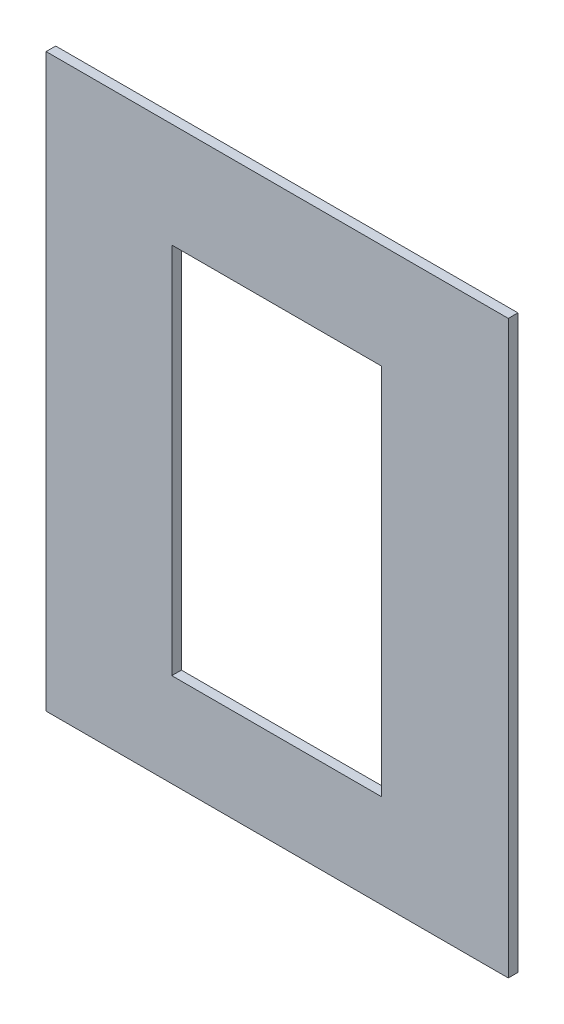
ISO-10303-21;
HEADER;
FILE_DESCRIPTION(('STEP AP214'),'2;1');
FILE_NAME('part.step','',(''),(''),'','','');
FILE_SCHEMA(('AUTOMOTIVE_DESIGN { 1 0 10303 214 1 1 1 1 }'));
ENDSEC;
DATA;
#1=APPLICATION_CONTEXT('core data for automotive mechanical design processes');
#2=APPLICATION_PROTOCOL_DEFINITION('international standard','automotive_design',2000,#1);
#3=PRODUCT_CONTEXT('',#1,'mechanical');
#4=PRODUCT('Part','Part','',(#3));
#5=PRODUCT_RELATED_PRODUCT_CATEGORY('part','',(#4));
#6=PRODUCT_DEFINITION_FORMATION('','',#4);
#7=PRODUCT_DEFINITION_CONTEXT('part definition',#1,'design');
#8=PRODUCT_DEFINITION('design','',#6,#7);
#9=PRODUCT_DEFINITION_SHAPE('','',#8);
#10=(LENGTH_UNIT() NAMED_UNIT(*) SI_UNIT(.MILLI.,.METRE.));
#11=(NAMED_UNIT(*) PLANE_ANGLE_UNIT() SI_UNIT($,.RADIAN.));
#12=(NAMED_UNIT(*) SI_UNIT($,.STERADIAN.) SOLID_ANGLE_UNIT());
#13=UNCERTAINTY_MEASURE_WITH_UNIT(LENGTH_MEASURE(1.E-05),#10,'distance_accuracy_value','');
#14=(GEOMETRIC_REPRESENTATION_CONTEXT(3) GLOBAL_UNCERTAINTY_ASSIGNED_CONTEXT((#13)) GLOBAL_UNIT_ASSIGNED_CONTEXT((#10,
#11,#12)) REPRESENTATION_CONTEXT('',''));
#15=CARTESIAN_POINT('',(0.,0.,0.));
#16=DIRECTION('',(0.,0.,1.));
#17=DIRECTION('',(1.,0.,0.));
#18=AXIS2_PLACEMENT_3D('',#15,#16,#17);
#19=CARTESIAN_POINT('',(438.94375,542.528125,18.25625));
#20=DIRECTION('',(-1.,0.,0.));
#21=DIRECTION('',(0.,-1.,0.));
#22=AXIS2_PLACEMENT_3D('',#19,#20,#21);
#23=PLANE('',#22);
#24=DIRECTION('',(0.,1.,0.));
#25=VECTOR('',#24,1.);
#26=CARTESIAN_POINT('',(438.94375,542.528125,0.));
#27=LINE('',#26,#25);
#28=CARTESIAN_POINT('',(438.94375,-542.528125,0.));
#29=VERTEX_POINT('',#28);
#30=CARTESIAN_POINT('',(438.94375,542.528125,0.));
#31=VERTEX_POINT('',#30);
#32=EDGE_CURVE('E124',#29,#31,#27,.T.);
#33=ORIENTED_EDGE('',*,*,#32,.T.);
#34=DIRECTION('',(0.,0.,-1.));
#35=VECTOR('',#34,1.);
#36=CARTESIAN_POINT('',(438.94375,542.528125,18.25625));
#37=LINE('',#36,#35);
#38=CARTESIAN_POINT('',(438.94375,542.528125,18.25625));
#39=VERTEX_POINT('',#38);
#40=EDGE_CURVE('E153',#39,#31,#37,.T.);
#41=ORIENTED_EDGE('',*,*,#40,.F.);
#42=DIRECTION('',(0.,1.,0.));
#43=VECTOR('',#42,1.);
#44=CARTESIAN_POINT('',(438.94375,542.528125,18.25625));
#45=LINE('',#44,#43);
#46=CARTESIAN_POINT('',(438.94375,-542.528125,18.25625));
#47=VERTEX_POINT('',#46);
#48=EDGE_CURVE('E127',#47,#39,#45,.T.);
#49=ORIENTED_EDGE('',*,*,#48,.F.);
#50=DIRECTION('',(0.,0.,-1.));
#51=VECTOR('',#50,1.);
#52=CARTESIAN_POINT('',(438.94375,-542.528125,18.25625));
#53=LINE('',#52,#51);
#54=EDGE_CURVE('E137',#47,#29,#53,.T.);
#55=ORIENTED_EDGE('',*,*,#54,.T.);
#56=EDGE_LOOP('',(#33,#41,#49,#55));
#57=FACE_BOUND('',#56,.T.);
#58=ADVANCED_FACE('F34',(#57),#23,.F.);
#59=CARTESIAN_POINT('',(-438.94375,542.528125,18.25625));
#60=DIRECTION('',(0.,-1.,0.));
#61=DIRECTION('',(0.,0.,-1.));
#62=AXIS2_PLACEMENT_3D('',#59,#60,#61);
#63=PLANE('',#62);
#64=DIRECTION('',(-1.,0.,0.));
#65=VECTOR('',#64,1.);
#66=CARTESIAN_POINT('',(-438.94375,542.528125,0.));
#67=LINE('',#66,#65);
#68=CARTESIAN_POINT('',(-438.94375,542.528125,0.));
#69=VERTEX_POINT('',#68);
#70=EDGE_CURVE('E140',#31,#69,#67,.T.);
#71=ORIENTED_EDGE('',*,*,#70,.T.);
#72=DIRECTION('',(0.,0.,-1.));
#73=VECTOR('',#72,1.);
#74=CARTESIAN_POINT('',(-438.94375,542.528125,18.25625));
#75=LINE('',#74,#73);
#76=CARTESIAN_POINT('',(-438.94375,542.528125,18.25625));
#77=VERTEX_POINT('',#76);
#78=EDGE_CURVE('E150',#77,#69,#75,.T.);
#79=ORIENTED_EDGE('',*,*,#78,.F.);
#80=DIRECTION('',(-1.,0.,0.));
#81=VECTOR('',#80,1.);
#82=CARTESIAN_POINT('',(-438.94375,542.528125,18.25625));
#83=LINE('',#82,#81);
#84=EDGE_CURVE('E130',#39,#77,#83,.T.);
#85=ORIENTED_EDGE('',*,*,#84,.F.);
#86=ORIENTED_EDGE('',*,*,#40,.T.);
#87=EDGE_LOOP('',(#71,#79,#85,#86));
#88=FACE_BOUND('',#87,.T.);
#89=ADVANCED_FACE('F177',(#88),#63,.F.);
#90=CARTESIAN_POINT('',(-438.94375,542.528125,18.25625));
#91=DIRECTION('',(1.,0.,0.));
#92=DIRECTION('',(0.,1.,0.));
#93=AXIS2_PLACEMENT_3D('',#90,#91,#92);
#94=PLANE('',#93);
#95=DIRECTION('',(0.,-1.,0.));
#96=VECTOR('',#95,1.);
#97=CARTESIAN_POINT('',(-438.94375,542.528125,0.));
#98=LINE('',#97,#96);
#99=CARTESIAN_POINT('',(-438.94375,-542.528125,0.));
#100=VERTEX_POINT('',#99);
#101=EDGE_CURVE('E142',#69,#100,#98,.T.);
#102=ORIENTED_EDGE('',*,*,#101,.T.);
#103=DIRECTION('',(0.,0.,-1.));
#104=VECTOR('',#103,1.);
#105=CARTESIAN_POINT('',(-438.94375,-542.528125,18.25625));
#106=LINE('',#105,#104);
#107=CARTESIAN_POINT('',(-438.94375,-542.528125,18.25625));
#108=VERTEX_POINT('',#107);
#109=EDGE_CURVE('E147',#108,#100,#106,.T.);
#110=ORIENTED_EDGE('',*,*,#109,.F.);
#111=DIRECTION('',(0.,-1.,0.));
#112=VECTOR('',#111,1.);
#113=CARTESIAN_POINT('',(-438.94375,542.528125,18.25625));
#114=LINE('',#113,#112);
#115=EDGE_CURVE('E133',#77,#108,#114,.T.);
#116=ORIENTED_EDGE('',*,*,#115,.F.);
#117=ORIENTED_EDGE('',*,*,#78,.T.);
#118=EDGE_LOOP('',(#102,#110,#116,#117));
#119=FACE_BOUND('',#118,.T.);
#120=ADVANCED_FACE('F182',(#119),#94,.F.);
#121=CARTESIAN_POINT('',(-438.94375,-542.528125,18.25625));
#122=DIRECTION('',(0.,1.,0.));
#123=DIRECTION('',(0.,0.,1.));
#124=AXIS2_PLACEMENT_3D('',#121,#122,#123);
#125=PLANE('',#124);
#126=DIRECTION('',(1.,0.,0.));
#127=VECTOR('',#126,1.);
#128=CARTESIAN_POINT('',(-438.94375,-542.528125,0.));
#129=LINE('',#128,#127);
#130=EDGE_CURVE('E131',#100,#29,#129,.T.);
#131=ORIENTED_EDGE('',*,*,#130,.T.);
#132=ORIENTED_EDGE('',*,*,#54,.F.);
#133=DIRECTION('',(1.,0.,0.));
#134=VECTOR('',#133,1.);
#135=CARTESIAN_POINT('',(-438.94375,-542.528125,18.25625));
#136=LINE('',#135,#134);
#137=EDGE_CURVE('E135',#108,#47,#136,.T.);
#138=ORIENTED_EDGE('',*,*,#137,.F.);
#139=ORIENTED_EDGE('',*,*,#109,.T.);
#140=EDGE_LOOP('',(#131,#132,#138,#139));
#141=FACE_BOUND('',#140,.T.);
#142=ADVANCED_FACE('F195',(#141),#125,.F.);
#143=CARTESIAN_POINT('',(0.,0.,18.25625));
#144=DIRECTION('',(0.,0.,1.));
#145=DIRECTION('',(1.,0.,0.));
#146=AXIS2_PLACEMENT_3D('',#143,#144,#145);
#147=PLANE('',#146);
#148=DIRECTION('',(0.,-1.,0.));
#149=VECTOR('',#148,1.);
#150=CARTESIAN_POINT('',(-200.18375,343.667917772943,18.25625));
#151=LINE('',#150,#149);
#152=CARTESIAN_POINT('',(-200.18375,343.667917772943,18.25625));
#153=VERTEX_POINT('',#152);
#154=CARTESIAN_POINT('',(-200.18375,-364.738082227057,18.25625));
#155=VERTEX_POINT('',#154);
#156=EDGE_CURVE('E48',#153,#155,#151,.T.);
#157=ORIENTED_EDGE('',*,*,#156,.F.);
#158=DIRECTION('',(-1.,0.,0.));
#159=VECTOR('',#158,1.);
#160=CARTESIAN_POINT('',(-200.18375,343.667917772943,18.25625));
#161=LINE('',#160,#159);
#162=CARTESIAN_POINT('',(198.34225,343.667917772943,18.25625));
#163=VERTEX_POINT('',#162);
#164=EDGE_CURVE('E117',#163,#153,#161,.T.);
#165=ORIENTED_EDGE('',*,*,#164,.F.);
#166=DIRECTION('',(0.,1.,0.));
#167=VECTOR('',#166,1.);
#168=CARTESIAN_POINT('',(198.34225,343.667917772943,18.25625));
#169=LINE('',#168,#167);
#170=CARTESIAN_POINT('',(198.34225,-364.738082227057,18.25625));
#171=VERTEX_POINT('',#170);
#172=EDGE_CURVE('E101',#171,#163,#169,.T.);
#173=ORIENTED_EDGE('',*,*,#172,.F.);
#174=DIRECTION('',(1.,0.,0.));
#175=VECTOR('',#174,1.);
#176=CARTESIAN_POINT('',(-200.18375,-364.738082227057,18.25625));
#177=LINE('',#176,#175);
#178=EDGE_CURVE('E110',#155,#171,#177,.T.);
#179=ORIENTED_EDGE('',*,*,#178,.F.);
#180=EDGE_LOOP('',(#157,#165,#173,#179));
#181=FACE_BOUND('',#180,.T.);
#182=ORIENTED_EDGE('',*,*,#48,.T.);
#183=ORIENTED_EDGE('',*,*,#84,.T.);
#184=ORIENTED_EDGE('',*,*,#115,.T.);
#185=ORIENTED_EDGE('',*,*,#137,.T.);
#186=EDGE_LOOP('',(#182,#183,#184,#185));
#187=FACE_BOUND('',#186,.T.);
#188=ADVANCED_FACE('F114',(#181,#187),#147,.T.);
#189=CARTESIAN_POINT('',(0.,0.,0.));
#190=DIRECTION('',(0.,0.,1.));
#191=DIRECTION('',(1.,0.,0.));
#192=AXIS2_PLACEMENT_3D('',#189,#190,#191);
#193=PLANE('',#192);
#194=DIRECTION('',(-1.,0.,0.));
#195=VECTOR('',#194,1.);
#196=CARTESIAN_POINT('',(0.,343.667917772943,0.));
#197=LINE('',#196,#195);
#198=CARTESIAN_POINT('',(198.34225,343.667917772943,0.));
#199=VERTEX_POINT('',#198);
#200=CARTESIAN_POINT('',(-200.18375,343.667917772943,0.));
#201=VERTEX_POINT('',#200);
#202=EDGE_CURVE('E41',#199,#201,#197,.T.);
#203=ORIENTED_EDGE('',*,*,#202,.T.);
#204=DIRECTION('',(0.,-1.,0.));
#205=VECTOR('',#204,1.);
#206=CARTESIAN_POINT('',(-200.18375,0.,0.));
#207=LINE('',#206,#205);
#208=CARTESIAN_POINT('',(-200.18375,-364.738082227057,0.));
#209=VERTEX_POINT('',#208);
#210=EDGE_CURVE('E11',#201,#209,#207,.T.);
#211=ORIENTED_EDGE('',*,*,#210,.T.);
#212=DIRECTION('',(1.,0.,0.));
#213=VECTOR('',#212,1.);
#214=CARTESIAN_POINT('',(0.,-364.738082227057,0.));
#215=LINE('',#214,#213);
#216=CARTESIAN_POINT('',(198.34225,-364.738082227057,0.));
#217=VERTEX_POINT('',#216);
#218=EDGE_CURVE('E156',#209,#217,#215,.T.);
#219=ORIENTED_EDGE('',*,*,#218,.T.);
#220=DIRECTION('',(0.,1.,0.));
#221=VECTOR('',#220,1.);
#222=CARTESIAN_POINT('',(198.34225,0.,0.));
#223=LINE('',#222,#221);
#224=EDGE_CURVE('E104',#217,#199,#223,.T.);
#225=ORIENTED_EDGE('',*,*,#224,.T.);
#226=EDGE_LOOP('',(#203,#211,#219,#225));
#227=FACE_BOUND('',#226,.T.);
#228=ORIENTED_EDGE('',*,*,#32,.F.);
#229=ORIENTED_EDGE('',*,*,#130,.F.);
#230=ORIENTED_EDGE('',*,*,#101,.F.);
#231=ORIENTED_EDGE('',*,*,#70,.F.);
#232=EDGE_LOOP('',(#228,#229,#230,#231));
#233=FACE_BOUND('',#232,.T.);
#234=ADVANCED_FACE('F160',(#227,#233),#193,.F.);
#235=CARTESIAN_POINT('',(-200.18375,343.667917772943,-0.793750000000003));
#236=DIRECTION('',(-1.,0.,0.));
#237=DIRECTION('',(0.,-1.,0.));
#238=AXIS2_PLACEMENT_3D('',#235,#236,#237);
#239=PLANE('',#238);
#240=DIRECTION('',(0.,0.,1.));
#241=VECTOR('',#240,1.);
#242=CARTESIAN_POINT('',(-200.18375,343.667917772943,-0.793750000000003));
#243=LINE('',#242,#241);
#244=EDGE_CURVE('E122',#201,#153,#243,.T.);
#245=ORIENTED_EDGE('',*,*,#244,.T.);
#246=ORIENTED_EDGE('',*,*,#156,.T.);
#247=DIRECTION('',(0.,0.,1.));
#248=VECTOR('',#247,1.);
#249=CARTESIAN_POINT('',(-200.18375,-364.738082227057,-0.793750000000003));
#250=LINE('',#249,#248);
#251=EDGE_CURVE('E107',#209,#155,#250,.T.);
#252=ORIENTED_EDGE('',*,*,#251,.F.);
#253=ORIENTED_EDGE('',*,*,#210,.F.);
#254=EDGE_LOOP('',(#245,#246,#252,#253));
#255=FACE_BOUND('',#254,.T.);
#256=ADVANCED_FACE('F165',(#255),#239,.F.);
#257=CARTESIAN_POINT('',(-200.18375,343.667917772943,-0.793750000000003));
#258=DIRECTION('',(0.,1.,0.));
#259=DIRECTION('',(0.,0.,1.));
#260=AXIS2_PLACEMENT_3D('',#257,#258,#259);
#261=PLANE('',#260);
#262=DIRECTION('',(0.,0.,1.));
#263=VECTOR('',#262,1.);
#264=CARTESIAN_POINT('',(198.34225,343.667917772943,-0.793750000000003));
#265=LINE('',#264,#263);
#266=EDGE_CURVE('E106',#199,#163,#265,.T.);
#267=ORIENTED_EDGE('',*,*,#266,.T.);
#268=ORIENTED_EDGE('',*,*,#164,.T.);
#269=ORIENTED_EDGE('',*,*,#244,.F.);
#270=ORIENTED_EDGE('',*,*,#202,.F.);
#271=EDGE_LOOP('',(#267,#268,#269,#270));
#272=FACE_BOUND('',#271,.T.);
#273=ADVANCED_FACE('F164',(#272),#261,.F.);
#274=CARTESIAN_POINT('',(198.34225,343.667917772943,-0.793750000000003));
#275=DIRECTION('',(1.,0.,0.));
#276=DIRECTION('',(0.,1.,0.));
#277=AXIS2_PLACEMENT_3D('',#274,#275,#276);
#278=PLANE('',#277);
#279=DIRECTION('',(0.,0.,1.));
#280=VECTOR('',#279,1.);
#281=CARTESIAN_POINT('',(198.34225,-364.738082227057,-0.793750000000003));
#282=LINE('',#281,#280);
#283=EDGE_CURVE('E56',#217,#171,#282,.T.);
#284=ORIENTED_EDGE('',*,*,#283,.T.);
#285=ORIENTED_EDGE('',*,*,#172,.T.);
#286=ORIENTED_EDGE('',*,*,#266,.F.);
#287=ORIENTED_EDGE('',*,*,#224,.F.);
#288=EDGE_LOOP('',(#284,#285,#286,#287));
#289=FACE_BOUND('',#288,.T.);
#290=ADVANCED_FACE('F98',(#289),#278,.F.);
#291=CARTESIAN_POINT('',(-200.18375,-364.738082227057,-0.793750000000003));
#292=DIRECTION('',(0.,-1.,0.));
#293=DIRECTION('',(0.,0.,-1.));
#294=AXIS2_PLACEMENT_3D('',#291,#292,#293);
#295=PLANE('',#294);
#296=ORIENTED_EDGE('',*,*,#251,.T.);
#297=ORIENTED_EDGE('',*,*,#178,.T.);
#298=ORIENTED_EDGE('',*,*,#283,.F.);
#299=ORIENTED_EDGE('',*,*,#218,.F.);
#300=EDGE_LOOP('',(#296,#297,#298,#299));
#301=FACE_BOUND('',#300,.T.);
#302=ADVANCED_FACE('F111',(#301),#295,.F.);
#303=CLOSED_SHELL('',(#58,#89,#120,#142,#188,#234,#256,#273,#290,#302));
#304=MANIFOLD_SOLID_BREP('B2',#303);
#305=ADVANCED_BREP_SHAPE_REPRESENTATION('',(#18,#304),#14);
#306=SHAPE_DEFINITION_REPRESENTATION(#9,#305);
ENDSEC;
END-ISO-10303-21;
